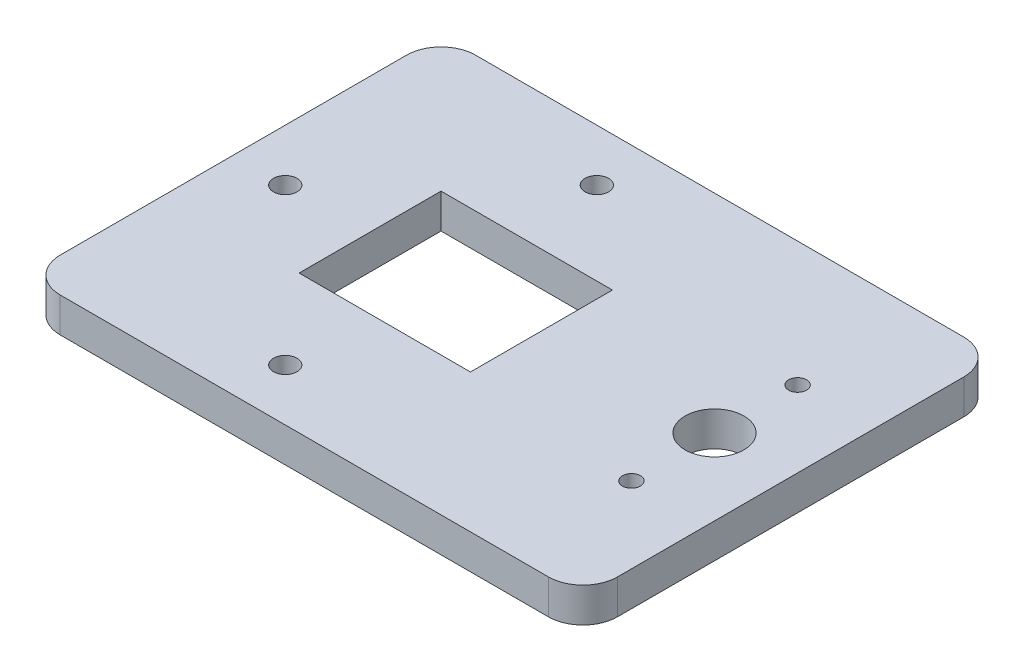
ISO-10303-21;
HEADER;
FILE_DESCRIPTION(('STEP AP214'),'2;1');
FILE_NAME('part.step','',(''),(''),'','','');
FILE_SCHEMA(('AUTOMOTIVE_DESIGN { 1 0 10303 214 1 1 1 1 }'));
ENDSEC;
DATA;
#1=APPLICATION_CONTEXT('core data for automotive mechanical design processes');
#2=APPLICATION_PROTOCOL_DEFINITION('international standard','automotive_design',2000,#1);
#3=PRODUCT_CONTEXT('',#1,'mechanical');
#4=PRODUCT('Part','Part','',(#3));
#5=PRODUCT_RELATED_PRODUCT_CATEGORY('part','',(#4));
#6=PRODUCT_DEFINITION_FORMATION('','',#4);
#7=PRODUCT_DEFINITION_CONTEXT('part definition',#1,'design');
#8=PRODUCT_DEFINITION('design','',#6,#7);
#9=PRODUCT_DEFINITION_SHAPE('','',#8);
#10=(LENGTH_UNIT() NAMED_UNIT(*) SI_UNIT(.MILLI.,.METRE.));
#11=(NAMED_UNIT(*) PLANE_ANGLE_UNIT() SI_UNIT($,.RADIAN.));
#12=(NAMED_UNIT(*) SI_UNIT($,.STERADIAN.) SOLID_ANGLE_UNIT());
#13=UNCERTAINTY_MEASURE_WITH_UNIT(LENGTH_MEASURE(1.E-05),#10,'distance_accuracy_value','');
#14=(GEOMETRIC_REPRESENTATION_CONTEXT(3) GLOBAL_UNCERTAINTY_ASSIGNED_CONTEXT((#13)) GLOBAL_UNIT_ASSIGNED_CONTEXT((#10,
#11,#12)) REPRESENTATION_CONTEXT('',''));
#15=CARTESIAN_POINT('',(0.,0.,0.));
#16=DIRECTION('',(0.,0.,1.));
#17=DIRECTION('',(1.,0.,0.));
#18=AXIS2_PLACEMENT_3D('',#15,#16,#17);
#19=CARTESIAN_POINT('',(60.5,10.,60.));
#20=DIRECTION('',(-1.,0.,0.));
#21=DIRECTION('',(0.,0.,1.));
#22=AXIS2_PLACEMENT_3D('',#19,#20,#21);
#23=PLANE('',#22);
#24=DIRECTION('',(0.,0.,-1.));
#25=VECTOR('',#24,1.);
#26=CARTESIAN_POINT('',(60.5,0.,60.));
#27=LINE('',#26,#25);
#28=CARTESIAN_POINT('',(60.5,0.,50.));
#29=VERTEX_POINT('',#28);
#30=CARTESIAN_POINT('',(60.5,0.,-50.));
#31=VERTEX_POINT('',#30);
#32=EDGE_CURVE('E194',#29,#31,#27,.T.);
#33=ORIENTED_EDGE('',*,*,#32,.T.);
#34=DIRECTION('',(0.,-1.,0.));
#35=VECTOR('',#34,1.);
#36=CARTESIAN_POINT('',(60.5,10.,-50.));
#37=LINE('',#36,#35);
#38=CARTESIAN_POINT('',(60.5,10.,-50.));
#39=VERTEX_POINT('',#38);
#40=EDGE_CURVE('E241',#31,#39,#37,.F.);
#41=ORIENTED_EDGE('',*,*,#40,.T.);
#42=DIRECTION('',(0.,0.,-1.));
#43=VECTOR('',#42,1.);
#44=CARTESIAN_POINT('',(60.5,10.,60.));
#45=LINE('',#44,#43);
#46=CARTESIAN_POINT('',(60.5,10.,50.));
#47=VERTEX_POINT('',#46);
#48=EDGE_CURVE('E196',#47,#39,#45,.T.);
#49=ORIENTED_EDGE('',*,*,#48,.F.);
#50=DIRECTION('',(0.,-1.,0.));
#51=VECTOR('',#50,1.);
#52=CARTESIAN_POINT('',(60.5,10.,50.));
#53=LINE('',#52,#51);
#54=EDGE_CURVE('E240',#47,#29,#53,.T.);
#55=ORIENTED_EDGE('',*,*,#54,.T.);
#56=EDGE_LOOP('',(#33,#41,#49,#55));
#57=FACE_BOUND('',#56,.T.);
#58=ADVANCED_FACE('F50',(#57),#23,.F.);
#59=CARTESIAN_POINT('',(-100.5,10.,-60.));
#60=DIRECTION('',(0.,0.,1.));
#61=DIRECTION('',(1.,0.,0.));
#62=AXIS2_PLACEMENT_3D('',#59,#60,#61);
#63=PLANE('',#62);
#64=DIRECTION('',(-1.,0.,0.));
#65=VECTOR('',#64,1.);
#66=CARTESIAN_POINT('',(-100.5,0.,-60.));
#67=LINE('',#66,#65);
#68=CARTESIAN_POINT('',(50.5,0.,-60.));
#69=VERTEX_POINT('',#68);
#70=CARTESIAN_POINT('',(-90.5,0.,-60.));
#71=VERTEX_POINT('',#70);
#72=EDGE_CURVE('E217',#69,#71,#67,.T.);
#73=ORIENTED_EDGE('',*,*,#72,.T.);
#74=DIRECTION('',(0.,-1.,0.));
#75=VECTOR('',#74,1.);
#76=CARTESIAN_POINT('',(-90.5,10.,-60.));
#77=LINE('',#76,#75);
#78=CARTESIAN_POINT('',(-90.5,10.,-60.));
#79=VERTEX_POINT('',#78);
#80=EDGE_CURVE('E74',#71,#79,#77,.F.);
#81=ORIENTED_EDGE('',*,*,#80,.T.);
#82=DIRECTION('',(-1.,0.,0.));
#83=VECTOR('',#82,1.);
#84=CARTESIAN_POINT('',(-100.5,10.,-60.));
#85=LINE('',#84,#83);
#86=CARTESIAN_POINT('',(50.5,10.,-60.));
#87=VERTEX_POINT('',#86);
#88=EDGE_CURVE('E203',#87,#79,#85,.T.);
#89=ORIENTED_EDGE('',*,*,#88,.F.);
#90=DIRECTION('',(0.,-1.,0.));
#91=VECTOR('',#90,1.);
#92=CARTESIAN_POINT('',(50.5,10.,-60.));
#93=LINE('',#92,#91);
#94=EDGE_CURVE('E213',#87,#69,#93,.T.);
#95=ORIENTED_EDGE('',*,*,#94,.T.);
#96=EDGE_LOOP('',(#73,#81,#89,#95));
#97=FACE_BOUND('',#96,.T.);
#98=ADVANCED_FACE('F282',(#97),#63,.F.);
#99=CARTESIAN_POINT('',(-100.5,10.,60.));
#100=DIRECTION('',(1.,0.,0.));
#101=DIRECTION('',(0.,0.,-1.));
#102=AXIS2_PLACEMENT_3D('',#99,#100,#101);
#103=PLANE('',#102);
#104=DIRECTION('',(0.,0.,1.));
#105=VECTOR('',#104,1.);
#106=CARTESIAN_POINT('',(-100.5,10.,60.));
#107=LINE('',#106,#105);
#108=CARTESIAN_POINT('',(-100.5,10.,-50.));
#109=VERTEX_POINT('',#108);
#110=CARTESIAN_POINT('',(-100.5,10.,50.));
#111=VERTEX_POINT('',#110);
#112=EDGE_CURVE('E206',#109,#111,#107,.T.);
#113=ORIENTED_EDGE('',*,*,#112,.F.);
#114=DIRECTION('',(0.,-1.,0.));
#115=VECTOR('',#114,1.);
#116=CARTESIAN_POINT('',(-100.5,10.,-50.));
#117=LINE('',#116,#115);
#118=CARTESIAN_POINT('',(-100.5,0.,-50.));
#119=VERTEX_POINT('',#118);
#120=EDGE_CURVE('E260',#109,#119,#117,.T.);
#121=ORIENTED_EDGE('',*,*,#120,.T.);
#122=DIRECTION('',(0.,0.,1.));
#123=VECTOR('',#122,1.);
#124=CARTESIAN_POINT('',(-100.5,0.,60.));
#125=LINE('',#124,#123);
#126=CARTESIAN_POINT('',(-100.5,0.,50.));
#127=VERTEX_POINT('',#126);
#128=EDGE_CURVE('E224',#119,#127,#125,.T.);
#129=ORIENTED_EDGE('',*,*,#128,.T.);
#130=DIRECTION('',(0.,-1.,0.));
#131=VECTOR('',#130,1.);
#132=CARTESIAN_POINT('',(-100.5,10.,50.));
#133=LINE('',#132,#131);
#134=EDGE_CURVE('E251',#127,#111,#133,.F.);
#135=ORIENTED_EDGE('',*,*,#134,.T.);
#136=EDGE_LOOP('',(#113,#121,#129,#135));
#137=FACE_BOUND('',#136,.T.);
#138=ADVANCED_FACE('F277',(#137),#103,.F.);
#139=CARTESIAN_POINT('',(-100.5,10.,60.));
#140=DIRECTION('',(0.,0.,-1.));
#141=DIRECTION('',(-1.,0.,0.));
#142=AXIS2_PLACEMENT_3D('',#139,#140,#141);
#143=PLANE('',#142);
#144=DIRECTION('',(1.,0.,0.));
#145=VECTOR('',#144,1.);
#146=CARTESIAN_POINT('',(-100.5,10.,60.));
#147=LINE('',#146,#145);
#148=CARTESIAN_POINT('',(-90.5,10.,60.));
#149=VERTEX_POINT('',#148);
#150=CARTESIAN_POINT('',(50.5,10.,60.));
#151=VERTEX_POINT('',#150);
#152=EDGE_CURVE('E211',#149,#151,#147,.T.);
#153=ORIENTED_EDGE('',*,*,#152,.F.);
#154=DIRECTION('',(0.,-1.,0.));
#155=VECTOR('',#154,1.);
#156=CARTESIAN_POINT('',(-90.5,10.,60.));
#157=LINE('',#156,#155);
#158=CARTESIAN_POINT('',(-90.5,0.,60.));
#159=VERTEX_POINT('',#158);
#160=EDGE_CURVE('E11',#149,#159,#157,.T.);
#161=ORIENTED_EDGE('',*,*,#160,.T.);
#162=DIRECTION('',(1.,0.,0.));
#163=VECTOR('',#162,1.);
#164=CARTESIAN_POINT('',(-100.5,0.,60.));
#165=LINE('',#164,#163);
#166=CARTESIAN_POINT('',(50.5,0.,60.));
#167=VERTEX_POINT('',#166);
#168=EDGE_CURVE('E202',#159,#167,#165,.T.);
#169=ORIENTED_EDGE('',*,*,#168,.T.);
#170=DIRECTION('',(0.,-1.,0.));
#171=VECTOR('',#170,1.);
#172=CARTESIAN_POINT('',(50.5,10.,60.));
#173=LINE('',#172,#171);
#174=EDGE_CURVE('E249',#167,#151,#173,.F.);
#175=ORIENTED_EDGE('',*,*,#174,.T.);
#176=EDGE_LOOP('',(#153,#161,#169,#175));
#177=FACE_BOUND('',#176,.T.);
#178=ADVANCED_FACE('F299',(#177),#143,.F.);
#179=CARTESIAN_POINT('',(0.,10.,0.));
#180=DIRECTION('',(0.,-1.,0.));
#181=DIRECTION('',(0.,0.,-1.));
#182=AXIS2_PLACEMENT_3D('',#179,#180,#181);
#183=PLANE('',#182);
#184=CARTESIAN_POINT('',(38.5000000000001,10.,-24.0000000000006));
#185=DIRECTION('',(0.,1.,0.));
#186=DIRECTION('',(0.,0.,1.));
#187=AXIS2_PLACEMENT_3D('',#184,#185,#186);
#188=CIRCLE('',#187,2.6);
#189=CARTESIAN_POINT('',(38.5000000000001,10.,-21.4000000000006));
#190=VERTEX_POINT('',#189);
#191=EDGE_CURVE('E514',#190,#190,#188,.T.);
#192=ORIENTED_EDGE('',*,*,#191,.F.);
#193=EDGE_LOOP('',(#192));
#194=FACE_BOUND('',#193,.T.);
#195=CARTESIAN_POINT('',(38.5000000000001,10.,23.9999999999994));
#196=DIRECTION('',(0.,1.,0.));
#197=DIRECTION('',(0.,0.,1.));
#198=AXIS2_PLACEMENT_3D('',#195,#196,#197);
#199=CIRCLE('',#198,2.6);
#200=CARTESIAN_POINT('',(38.5000000000001,10.,26.5999999999994));
#201=VERTEX_POINT('',#200);
#202=EDGE_CURVE('E513',#201,#201,#199,.T.);
#203=ORIENTED_EDGE('',*,*,#202,.F.);
#204=EDGE_LOOP('',(#203));
#205=FACE_BOUND('',#204,.T.);
#206=CARTESIAN_POINT('',(-40.500000000008,10.,45.));
#207=DIRECTION('',(0.,-1.,0.));
#208=DIRECTION('',(0.,0.,-1.));
#209=AXIS2_PLACEMENT_3D('',#206,#207,#208);
#210=CIRCLE('',#209,3.4);
#211=CARTESIAN_POINT('',(-40.500000000008,10.,41.6));
#212=VERTEX_POINT('',#211);
#213=EDGE_CURVE('E526',#212,#212,#210,.T.);
#214=ORIENTED_EDGE('',*,*,#213,.T.);
#215=EDGE_LOOP('',(#214));
#216=FACE_BOUND('',#215,.T.);
#217=CARTESIAN_POINT('',(-85.5,10.,-1.12323345069498E-13));
#218=DIRECTION('',(0.,-1.,0.));
#219=DIRECTION('',(0.,0.,-1.));
#220=AXIS2_PLACEMENT_3D('',#217,#218,#219);
#221=CIRCLE('',#220,3.4);
#222=CARTESIAN_POINT('',(-85.5,10.,-3.40000000000011));
#223=VERTEX_POINT('',#222);
#224=EDGE_CURVE('E538',#223,#223,#221,.T.);
#225=ORIENTED_EDGE('',*,*,#224,.T.);
#226=EDGE_LOOP('',(#225));
#227=FACE_BOUND('',#226,.T.);
#228=CARTESIAN_POINT('',(-40.500000000008,10.,-45.));
#229=DIRECTION('',(0.,-1.,0.));
#230=DIRECTION('',(0.,0.,-1.));
#231=AXIS2_PLACEMENT_3D('',#228,#229,#230);
#232=CIRCLE('',#231,3.4);
#233=CARTESIAN_POINT('',(-40.500000000008,10.,-48.4));
#234=VERTEX_POINT('',#233);
#235=EDGE_CURVE('E520',#234,#234,#232,.T.);
#236=ORIENTED_EDGE('',*,*,#235,.T.);
#237=EDGE_LOOP('',(#236));
#238=FACE_BOUND('',#237,.T.);
#239=CARTESIAN_POINT('',(38.5000000000001,10.,-6.04442711160669E-13));
#240=DIRECTION('',(0.,1.,0.));
#241=DIRECTION('',(0.,0.,1.));
#242=AXIS2_PLACEMENT_3D('',#239,#240,#241);
#243=CIRCLE('',#242,8.5);
#244=CARTESIAN_POINT('',(38.5000000000001,10.,8.49999999999939));
#245=VERTEX_POINT('',#244);
#246=EDGE_CURVE('E176',#245,#245,#243,.T.);
#247=ORIENTED_EDGE('',*,*,#246,.F.);
#248=EDGE_LOOP('',(#247));
#249=FACE_BOUND('',#248,.T.);
#250=DIRECTION('',(1.,0.,0.));
#251=VECTOR('',#250,1.);
#252=CARTESIAN_POINT('',(-11.9999999999999,10.,19.9999999999964));
#253=LINE('',#252,#251);
#254=CARTESIAN_POINT('',(-61.4999999999999,10.,19.9999999999964));
#255=VERTEX_POINT('',#254);
#256=CARTESIAN_POINT('',(-11.9999999999999,10.,19.9999999999964));
#257=VERTEX_POINT('',#256);
#258=EDGE_CURVE('E184',#255,#257,#253,.T.);
#259=ORIENTED_EDGE('',*,*,#258,.F.);
#260=DIRECTION('',(0.,0.,1.));
#261=VECTOR('',#260,1.);
#262=CARTESIAN_POINT('',(-61.4999999999999,10.,19.9999999999964));
#263=LINE('',#262,#261);
#264=CARTESIAN_POINT('',(-61.4999999999999,10.,-21.0000000000036));
#265=VERTEX_POINT('',#264);
#266=EDGE_CURVE('E150',#265,#255,#263,.T.);
#267=ORIENTED_EDGE('',*,*,#266,.F.);
#268=DIRECTION('',(-1.,0.,0.));
#269=VECTOR('',#268,1.);
#270=CARTESIAN_POINT('',(-11.9999999999999,10.,-21.0000000000036));
#271=LINE('',#270,#269);
#272=CARTESIAN_POINT('',(-11.9999999999999,10.,-21.0000000000036));
#273=VERTEX_POINT('',#272);
#274=EDGE_CURVE('E166',#273,#265,#271,.T.);
#275=ORIENTED_EDGE('',*,*,#274,.F.);
#276=DIRECTION('',(0.,0.,-1.));
#277=VECTOR('',#276,1.);
#278=CARTESIAN_POINT('',(-11.9999999999999,10.,19.9999999999964));
#279=LINE('',#278,#277);
#280=EDGE_CURVE('E173',#257,#273,#279,.T.);
#281=ORIENTED_EDGE('',*,*,#280,.F.);
#282=EDGE_LOOP('',(#259,#267,#275,#281));
#283=FACE_BOUND('',#282,.T.);
#284=ORIENTED_EDGE('',*,*,#88,.T.);
#285=CARTESIAN_POINT('',(-90.5,10.,-50.));
#286=DIRECTION('',(0.,-1.,0.));
#287=DIRECTION('',(0.,0.,-1.));
#288=AXIS2_PLACEMENT_3D('',#285,#286,#287);
#289=CIRCLE('',#288,10.);
#290=EDGE_CURVE('E57',#79,#109,#289,.F.);
#291=ORIENTED_EDGE('',*,*,#290,.T.);
#292=ORIENTED_EDGE('',*,*,#112,.T.);
#293=CARTESIAN_POINT('',(-90.5,10.,50.));
#294=DIRECTION('',(0.,-1.,0.));
#295=DIRECTION('',(0.,0.,-1.));
#296=AXIS2_PLACEMENT_3D('',#293,#294,#295);
#297=CIRCLE('',#296,10.);
#298=EDGE_CURVE('E62',#111,#149,#297,.F.);
#299=ORIENTED_EDGE('',*,*,#298,.T.);
#300=ORIENTED_EDGE('',*,*,#152,.T.);
#301=CARTESIAN_POINT('',(50.5,10.,50.));
#302=DIRECTION('',(0.,-1.,0.));
#303=DIRECTION('',(0.,0.,-1.));
#304=AXIS2_PLACEMENT_3D('',#301,#302,#303);
#305=CIRCLE('',#304,10.);
#306=EDGE_CURVE('E242',#151,#47,#305,.F.);
#307=ORIENTED_EDGE('',*,*,#306,.T.);
#308=ORIENTED_EDGE('',*,*,#48,.T.);
#309=CARTESIAN_POINT('',(50.5,10.,-50.));
#310=DIRECTION('',(0.,-1.,0.));
#311=DIRECTION('',(0.,0.,-1.));
#312=AXIS2_PLACEMENT_3D('',#309,#310,#311);
#313=CIRCLE('',#312,10.);
#314=EDGE_CURVE('E250',#39,#87,#313,.F.);
#315=ORIENTED_EDGE('',*,*,#314,.T.);
#316=EDGE_LOOP('',(#284,#291,#292,#299,#300,#307,#308,#315));
#317=FACE_BOUND('',#316,.T.);
#318=ADVANCED_FACE('F274',(#194,#205,#216,#227,#238,#249,#283,#317),#183,.F.);
#319=CARTESIAN_POINT('',(0.,0.,0.));
#320=DIRECTION('',(0.,-1.,0.));
#321=DIRECTION('',(0.,0.,-1.));
#322=AXIS2_PLACEMENT_3D('',#319,#320,#321);
#323=PLANE('',#322);
#324=CARTESIAN_POINT('',(38.5000000000001,0.,-24.0000000000006));
#325=DIRECTION('',(0.,1.,0.));
#326=DIRECTION('',(0.,0.,1.));
#327=AXIS2_PLACEMENT_3D('',#324,#325,#326);
#328=CIRCLE('',#327,2.6);
#329=CARTESIAN_POINT('',(38.5000000000001,0.,-21.4000000000006));
#330=VERTEX_POINT('',#329);
#331=EDGE_CURVE('E509',#330,#330,#328,.T.);
#332=ORIENTED_EDGE('',*,*,#331,.T.);
#333=EDGE_LOOP('',(#332));
#334=FACE_BOUND('',#333,.T.);
#335=CARTESIAN_POINT('',(38.5000000000001,0.,23.9999999999994));
#336=DIRECTION('',(0.,1.,0.));
#337=DIRECTION('',(0.,0.,1.));
#338=AXIS2_PLACEMENT_3D('',#335,#336,#337);
#339=CIRCLE('',#338,2.6);
#340=CARTESIAN_POINT('',(38.5000000000001,0.,26.5999999999994));
#341=VERTEX_POINT('',#340);
#342=EDGE_CURVE('E523',#341,#341,#339,.T.);
#343=ORIENTED_EDGE('',*,*,#342,.T.);
#344=EDGE_LOOP('',(#343));
#345=FACE_BOUND('',#344,.T.);
#346=CARTESIAN_POINT('',(-40.500000000008,0.,45.));
#347=DIRECTION('',(0.,-1.,0.));
#348=DIRECTION('',(0.,0.,-1.));
#349=AXIS2_PLACEMENT_3D('',#346,#347,#348);
#350=CIRCLE('',#349,3.4);
#351=CARTESIAN_POINT('',(-40.500000000008,0.,41.6));
#352=VERTEX_POINT('',#351);
#353=EDGE_CURVE('E532',#352,#352,#350,.T.);
#354=ORIENTED_EDGE('',*,*,#353,.F.);
#355=EDGE_LOOP('',(#354));
#356=FACE_BOUND('',#355,.T.);
#357=CARTESIAN_POINT('',(-85.5,0.,-1.12323345069498E-13));
#358=DIRECTION('',(0.,-1.,0.));
#359=DIRECTION('',(0.,0.,-1.));
#360=AXIS2_PLACEMENT_3D('',#357,#358,#359);
#361=CIRCLE('',#360,3.4);
#362=CARTESIAN_POINT('',(-85.5,0.,-3.40000000000011));
#363=VERTEX_POINT('',#362);
#364=EDGE_CURVE('E533',#363,#363,#361,.T.);
#365=ORIENTED_EDGE('',*,*,#364,.F.);
#366=EDGE_LOOP('',(#365));
#367=FACE_BOUND('',#366,.T.);
#368=CARTESIAN_POINT('',(-40.500000000008,0.,-45.));
#369=DIRECTION('',(0.,-1.,0.));
#370=DIRECTION('',(0.,0.,-1.));
#371=AXIS2_PLACEMENT_3D('',#368,#369,#370);
#372=CIRCLE('',#371,3.4);
#373=CARTESIAN_POINT('',(-40.500000000008,0.,-48.4));
#374=VERTEX_POINT('',#373);
#375=EDGE_CURVE('E542',#374,#374,#372,.T.);
#376=ORIENTED_EDGE('',*,*,#375,.F.);
#377=EDGE_LOOP('',(#376));
#378=FACE_BOUND('',#377,.T.);
#379=CARTESIAN_POINT('',(38.5000000000001,0.,-6.04442711160669E-13));
#380=DIRECTION('',(0.,1.,0.));
#381=DIRECTION('',(0.,0.,1.));
#382=AXIS2_PLACEMENT_3D('',#379,#380,#381);
#383=CIRCLE('',#382,8.5);
#384=CARTESIAN_POINT('',(38.5000000000001,0.,8.49999999999939));
#385=VERTEX_POINT('',#384);
#386=EDGE_CURVE('E187',#385,#385,#383,.T.);
#387=ORIENTED_EDGE('',*,*,#386,.T.);
#388=EDGE_LOOP('',(#387));
#389=FACE_BOUND('',#388,.T.);
#390=DIRECTION('',(0.,0.,1.));
#391=VECTOR('',#390,1.);
#392=CARTESIAN_POINT('',(-61.4999999999999,0.,19.9999999999964));
#393=LINE('',#392,#391);
#394=CARTESIAN_POINT('',(-61.4999999999999,0.,-21.0000000000036));
#395=VERTEX_POINT('',#394);
#396=CARTESIAN_POINT('',(-61.4999999999999,0.,19.9999999999964));
#397=VERTEX_POINT('',#396);
#398=EDGE_CURVE('E144',#395,#397,#393,.T.);
#399=ORIENTED_EDGE('',*,*,#398,.T.);
#400=DIRECTION('',(1.,0.,0.));
#401=VECTOR('',#400,1.);
#402=CARTESIAN_POINT('',(-11.9999999999999,0.,19.9999999999964));
#403=LINE('',#402,#401);
#404=CARTESIAN_POINT('',(-11.9999999999999,0.,19.9999999999964));
#405=VERTEX_POINT('',#404);
#406=EDGE_CURVE('E156',#397,#405,#403,.T.);
#407=ORIENTED_EDGE('',*,*,#406,.T.);
#408=DIRECTION('',(0.,0.,-1.));
#409=VECTOR('',#408,1.);
#410=CARTESIAN_POINT('',(-11.9999999999999,0.,19.9999999999964));
#411=LINE('',#410,#409);
#412=CARTESIAN_POINT('',(-11.9999999999999,0.,-21.0000000000036));
#413=VERTEX_POINT('',#412);
#414=EDGE_CURVE('E162',#405,#413,#411,.T.);
#415=ORIENTED_EDGE('',*,*,#414,.T.);
#416=DIRECTION('',(-1.,0.,0.));
#417=VECTOR('',#416,1.);
#418=CARTESIAN_POINT('',(-11.9999999999999,0.,-21.0000000000036));
#419=LINE('',#418,#417);
#420=EDGE_CURVE('E152',#413,#395,#419,.T.);
#421=ORIENTED_EDGE('',*,*,#420,.T.);
#422=EDGE_LOOP('',(#399,#407,#415,#421));
#423=FACE_BOUND('',#422,.T.);
#424=ORIENTED_EDGE('',*,*,#128,.F.);
#425=CARTESIAN_POINT('',(-90.5,0.,-50.));
#426=DIRECTION('',(0.,-1.,0.));
#427=DIRECTION('',(0.,0.,-1.));
#428=AXIS2_PLACEMENT_3D('',#425,#426,#427);
#429=CIRCLE('',#428,10.);
#430=EDGE_CURVE('E265',#119,#71,#429,.T.);
#431=ORIENTED_EDGE('',*,*,#430,.T.);
#432=ORIENTED_EDGE('',*,*,#72,.F.);
#433=CARTESIAN_POINT('',(50.5,0.,-50.));
#434=DIRECTION('',(0.,-1.,0.));
#435=DIRECTION('',(0.,0.,-1.));
#436=AXIS2_PLACEMENT_3D('',#433,#434,#435);
#437=CIRCLE('',#436,10.);
#438=EDGE_CURVE('E234',#69,#31,#437,.T.);
#439=ORIENTED_EDGE('',*,*,#438,.T.);
#440=ORIENTED_EDGE('',*,*,#32,.F.);
#441=CARTESIAN_POINT('',(50.5,0.,50.));
#442=DIRECTION('',(0.,-1.,0.));
#443=DIRECTION('',(0.,0.,-1.));
#444=AXIS2_PLACEMENT_3D('',#441,#442,#443);
#445=CIRCLE('',#444,10.);
#446=EDGE_CURVE('E229',#29,#167,#445,.T.);
#447=ORIENTED_EDGE('',*,*,#446,.T.);
#448=ORIENTED_EDGE('',*,*,#168,.F.);
#449=CARTESIAN_POINT('',(-90.5,0.,50.));
#450=DIRECTION('',(0.,-1.,0.));
#451=DIRECTION('',(0.,0.,-1.));
#452=AXIS2_PLACEMENT_3D('',#449,#450,#451);
#453=CIRCLE('',#452,10.);
#454=EDGE_CURVE('E263',#159,#127,#453,.T.);
#455=ORIENTED_EDGE('',*,*,#454,.T.);
#456=EDGE_LOOP('',(#424,#431,#432,#439,#440,#447,#448,#455));
#457=FACE_BOUND('',#456,.T.);
#458=ADVANCED_FACE('F165',(#334,#345,#356,#367,#378,#389,#423,#457),#323,.T.);
#459=CARTESIAN_POINT('',(50.5,10.,-50.));
#460=DIRECTION('',(0.,-1.,0.));
#461=DIRECTION('',(0.,0.,-1.));
#462=AXIS2_PLACEMENT_3D('',#459,#460,#461);
#463=CYLINDRICAL_SURFACE('',#462,10.);
#464=ORIENTED_EDGE('',*,*,#314,.F.);
#465=ORIENTED_EDGE('',*,*,#40,.F.);
#466=ORIENTED_EDGE('',*,*,#438,.F.);
#467=ORIENTED_EDGE('',*,*,#94,.F.);
#468=EDGE_LOOP('',(#464,#465,#466,#467));
#469=FACE_BOUND('',#468,.T.);
#470=ADVANCED_FACE('F286',(#469),#463,.T.);
#471=CARTESIAN_POINT('',(50.5,10.,50.));
#472=DIRECTION('',(0.,-1.,0.));
#473=DIRECTION('',(0.,0.,-1.));
#474=AXIS2_PLACEMENT_3D('',#471,#472,#473);
#475=CYLINDRICAL_SURFACE('',#474,10.);
#476=ORIENTED_EDGE('',*,*,#306,.F.);
#477=ORIENTED_EDGE('',*,*,#174,.F.);
#478=ORIENTED_EDGE('',*,*,#446,.F.);
#479=ORIENTED_EDGE('',*,*,#54,.F.);
#480=EDGE_LOOP('',(#476,#477,#478,#479));
#481=FACE_BOUND('',#480,.T.);
#482=ADVANCED_FACE('F294',(#481),#475,.T.);
#483=CARTESIAN_POINT('',(-61.4999999999999,0.,19.9999999999964));
#484=DIRECTION('',(-1.,0.,0.));
#485=DIRECTION('',(0.,0.,1.));
#486=AXIS2_PLACEMENT_3D('',#483,#484,#485);
#487=PLANE('',#486);
#488=ORIENTED_EDGE('',*,*,#266,.T.);
#489=DIRECTION('',(0.,1.,0.));
#490=VECTOR('',#489,1.);
#491=CARTESIAN_POINT('',(-61.4999999999999,0.,19.9999999999964));
#492=LINE('',#491,#490);
#493=EDGE_CURVE('E137',#397,#255,#492,.T.);
#494=ORIENTED_EDGE('',*,*,#493,.F.);
#495=ORIENTED_EDGE('',*,*,#398,.F.);
#496=DIRECTION('',(0.,1.,0.));
#497=VECTOR('',#496,1.);
#498=CARTESIAN_POINT('',(-61.4999999999999,0.,-21.0000000000036));
#499=LINE('',#498,#497);
#500=EDGE_CURVE('E195',#395,#265,#499,.T.);
#501=ORIENTED_EDGE('',*,*,#500,.T.);
#502=EDGE_LOOP('',(#488,#494,#495,#501));
#503=FACE_BOUND('',#502,.T.);
#504=ADVANCED_FACE('F145',(#503),#487,.F.);
#505=CARTESIAN_POINT('',(-11.9999999999999,0.,-21.0000000000036));
#506=DIRECTION('',(0.,0.,-1.));
#507=DIRECTION('',(-1.,0.,0.));
#508=AXIS2_PLACEMENT_3D('',#505,#506,#507);
#509=PLANE('',#508);
#510=ORIENTED_EDGE('',*,*,#274,.T.);
#511=ORIENTED_EDGE('',*,*,#500,.F.);
#512=ORIENTED_EDGE('',*,*,#420,.F.);
#513=DIRECTION('',(0.,1.,0.));
#514=VECTOR('',#513,1.);
#515=CARTESIAN_POINT('',(-11.9999999999999,0.,-21.0000000000036));
#516=LINE('',#515,#514);
#517=EDGE_CURVE('E198',#413,#273,#516,.T.);
#518=ORIENTED_EDGE('',*,*,#517,.T.);
#519=EDGE_LOOP('',(#510,#511,#512,#518));
#520=FACE_BOUND('',#519,.T.);
#521=ADVANCED_FACE('F322',(#520),#509,.F.);
#522=CARTESIAN_POINT('',(-11.9999999999999,0.,19.9999999999964));
#523=DIRECTION('',(1.,0.,0.));
#524=DIRECTION('',(0.,0.,-1.));
#525=AXIS2_PLACEMENT_3D('',#522,#523,#524);
#526=PLANE('',#525);
#527=ORIENTED_EDGE('',*,*,#280,.T.);
#528=ORIENTED_EDGE('',*,*,#517,.F.);
#529=ORIENTED_EDGE('',*,*,#414,.F.);
#530=DIRECTION('',(0.,1.,0.));
#531=VECTOR('',#530,1.);
#532=CARTESIAN_POINT('',(-11.9999999999999,0.,19.9999999999964));
#533=LINE('',#532,#531);
#534=EDGE_CURVE('E154',#405,#257,#533,.T.);
#535=ORIENTED_EDGE('',*,*,#534,.T.);
#536=EDGE_LOOP('',(#527,#528,#529,#535));
#537=FACE_BOUND('',#536,.T.);
#538=ADVANCED_FACE('F329',(#537),#526,.F.);
#539=CARTESIAN_POINT('',(-11.9999999999999,0.,19.9999999999964));
#540=DIRECTION('',(0.,0.,1.));
#541=DIRECTION('',(1.,0.,0.));
#542=AXIS2_PLACEMENT_3D('',#539,#540,#541);
#543=PLANE('',#542);
#544=ORIENTED_EDGE('',*,*,#258,.T.);
#545=ORIENTED_EDGE('',*,*,#534,.F.);
#546=ORIENTED_EDGE('',*,*,#406,.F.);
#547=ORIENTED_EDGE('',*,*,#493,.T.);
#548=EDGE_LOOP('',(#544,#545,#546,#547));
#549=FACE_BOUND('',#548,.T.);
#550=ADVANCED_FACE('F160',(#549),#543,.F.);
#551=CARTESIAN_POINT('',(38.5000000000001,0.,-6.04442711160669E-13));
#552=DIRECTION('',(0.,1.,0.));
#553=DIRECTION('',(0.,0.,1.));
#554=AXIS2_PLACEMENT_3D('',#551,#552,#553);
#555=CYLINDRICAL_SURFACE('',#554,8.5);
#556=ORIENTED_EDGE('',*,*,#386,.F.);
#557=EDGE_LOOP('',(#556));
#558=FACE_BOUND('',#557,.T.);
#559=ORIENTED_EDGE('',*,*,#246,.T.);
#560=EDGE_LOOP('',(#559));
#561=FACE_BOUND('',#560,.T.);
#562=ADVANCED_FACE('F309',(#558,#561),#555,.F.);
#563=CARTESIAN_POINT('',(-90.5,10.,-50.));
#564=DIRECTION('',(0.,-1.,0.));
#565=DIRECTION('',(0.,0.,-1.));
#566=AXIS2_PLACEMENT_3D('',#563,#564,#565);
#567=CYLINDRICAL_SURFACE('',#566,10.);
#568=ORIENTED_EDGE('',*,*,#290,.F.);
#569=ORIENTED_EDGE('',*,*,#80,.F.);
#570=ORIENTED_EDGE('',*,*,#430,.F.);
#571=ORIENTED_EDGE('',*,*,#120,.F.);
#572=EDGE_LOOP('',(#568,#569,#570,#571));
#573=FACE_BOUND('',#572,.T.);
#574=ADVANCED_FACE('F283',(#573),#567,.T.);
#575=CARTESIAN_POINT('',(-90.5,10.,50.));
#576=DIRECTION('',(0.,-1.,0.));
#577=DIRECTION('',(0.,0.,-1.));
#578=AXIS2_PLACEMENT_3D('',#575,#576,#577);
#579=CYLINDRICAL_SURFACE('',#578,10.);
#580=ORIENTED_EDGE('',*,*,#298,.F.);
#581=ORIENTED_EDGE('',*,*,#134,.F.);
#582=ORIENTED_EDGE('',*,*,#454,.F.);
#583=ORIENTED_EDGE('',*,*,#160,.F.);
#584=EDGE_LOOP('',(#580,#581,#582,#583));
#585=FACE_BOUND('',#584,.T.);
#586=ADVANCED_FACE('F47',(#585),#579,.T.);
#587=CARTESIAN_POINT('',(-40.500000000008,10.,-45.));
#588=DIRECTION('',(0.,-1.,0.));
#589=DIRECTION('',(0.,0.,-1.));
#590=AXIS2_PLACEMENT_3D('',#587,#588,#589);
#591=CYLINDRICAL_SURFACE('',#590,3.4);
#592=ORIENTED_EDGE('',*,*,#235,.F.);
#593=EDGE_LOOP('',(#592));
#594=FACE_BOUND('',#593,.T.);
#595=ORIENTED_EDGE('',*,*,#375,.T.);
#596=EDGE_LOOP('',(#595));
#597=FACE_BOUND('',#596,.T.);
#598=ADVANCED_FACE('F303',(#594,#597),#591,.F.);
#599=CARTESIAN_POINT('',(-85.5,10.,-1.12323345069498E-13));
#600=DIRECTION('',(0.,-1.,0.));
#601=DIRECTION('',(0.,0.,-1.));
#602=AXIS2_PLACEMENT_3D('',#599,#600,#601);
#603=CYLINDRICAL_SURFACE('',#602,3.4);
#604=ORIENTED_EDGE('',*,*,#224,.F.);
#605=EDGE_LOOP('',(#604));
#606=FACE_BOUND('',#605,.T.);
#607=ORIENTED_EDGE('',*,*,#364,.T.);
#608=EDGE_LOOP('',(#607));
#609=FACE_BOUND('',#608,.T.);
#610=ADVANCED_FACE('F310',(#606,#609),#603,.F.);
#611=CARTESIAN_POINT('',(-40.500000000008,10.,45.));
#612=DIRECTION('',(0.,-1.,0.));
#613=DIRECTION('',(0.,0.,-1.));
#614=AXIS2_PLACEMENT_3D('',#611,#612,#613);
#615=CYLINDRICAL_SURFACE('',#614,3.4);
#616=ORIENTED_EDGE('',*,*,#213,.F.);
#617=EDGE_LOOP('',(#616));
#618=FACE_BOUND('',#617,.T.);
#619=ORIENTED_EDGE('',*,*,#353,.T.);
#620=EDGE_LOOP('',(#619));
#621=FACE_BOUND('',#620,.T.);
#622=ADVANCED_FACE('F457',(#618,#621),#615,.F.);
#623=CARTESIAN_POINT('',(38.5000000000001,0.,23.9999999999994));
#624=DIRECTION('',(0.,1.,0.));
#625=DIRECTION('',(0.,0.,1.));
#626=AXIS2_PLACEMENT_3D('',#623,#624,#625);
#627=CYLINDRICAL_SURFACE('',#626,2.6);
#628=ORIENTED_EDGE('',*,*,#342,.F.);
#629=EDGE_LOOP('',(#628));
#630=FACE_BOUND('',#629,.T.);
#631=ORIENTED_EDGE('',*,*,#202,.T.);
#632=EDGE_LOOP('',(#631));
#633=FACE_BOUND('',#632,.T.);
#634=ADVANCED_FACE('F466',(#630,#633),#627,.F.);
#635=CARTESIAN_POINT('',(38.5000000000001,0.,-24.0000000000006));
#636=DIRECTION('',(0.,1.,0.));
#637=DIRECTION('',(0.,0.,1.));
#638=AXIS2_PLACEMENT_3D('',#635,#636,#637);
#639=CYLINDRICAL_SURFACE('',#638,2.6);
#640=ORIENTED_EDGE('',*,*,#331,.F.);
#641=EDGE_LOOP('',(#640));
#642=FACE_BOUND('',#641,.T.);
#643=ORIENTED_EDGE('',*,*,#191,.T.);
#644=EDGE_LOOP('',(#643));
#645=FACE_BOUND('',#644,.T.);
#646=ADVANCED_FACE('F479',(#642,#645),#639,.F.);
#647=CLOSED_SHELL('',(#58,#98,#138,#178,#318,#458,#470,#482,#504,#521,#538,#550,#562,#574,#586,
#598,#610,#622,#634,#646));
#648=MANIFOLD_SOLID_BREP('B2',#647);
#649=ADVANCED_BREP_SHAPE_REPRESENTATION('',(#18,#648),#14);
#650=SHAPE_DEFINITION_REPRESENTATION(#9,#649);
ENDSEC;
END-ISO-10303-21;
